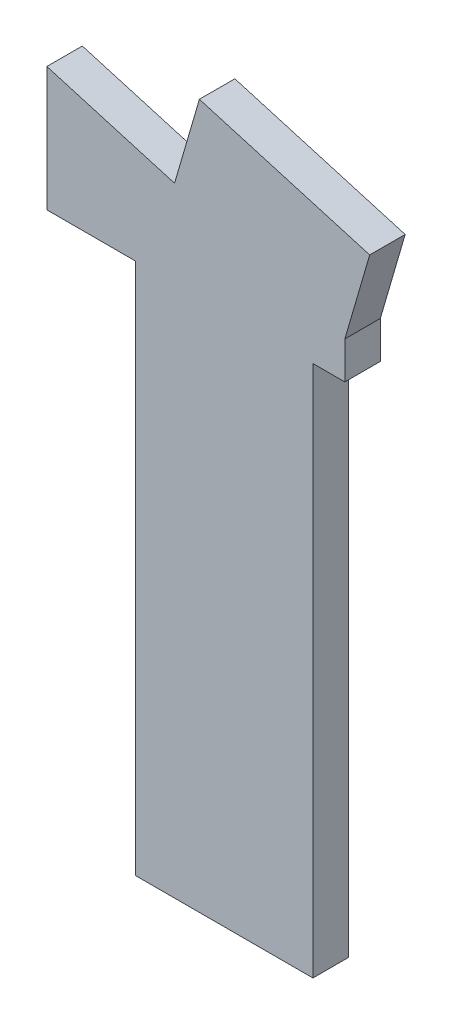
ISO-10303-21;
HEADER;
FILE_DESCRIPTION(('STEP AP214'),'2;1');
FILE_NAME('part.step','',(''),(''),'','','');
FILE_SCHEMA(('AUTOMOTIVE_DESIGN { 1 0 10303 214 1 1 1 1 }'));
ENDSEC;
DATA;
#1=APPLICATION_CONTEXT('core data for automotive mechanical design processes');
#2=APPLICATION_PROTOCOL_DEFINITION('international standard','automotive_design',2000,#1);
#3=PRODUCT_CONTEXT('',#1,'mechanical');
#4=PRODUCT('Part','Part','',(#3));
#5=PRODUCT_RELATED_PRODUCT_CATEGORY('part','',(#4));
#6=PRODUCT_DEFINITION_FORMATION('','',#4);
#7=PRODUCT_DEFINITION_CONTEXT('part definition',#1,'design');
#8=PRODUCT_DEFINITION('design','',#6,#7);
#9=PRODUCT_DEFINITION_SHAPE('','',#8);
#10=(LENGTH_UNIT() NAMED_UNIT(*) SI_UNIT(.MILLI.,.METRE.));
#11=(NAMED_UNIT(*) PLANE_ANGLE_UNIT() SI_UNIT($,.RADIAN.));
#12=(NAMED_UNIT(*) SI_UNIT($,.STERADIAN.) SOLID_ANGLE_UNIT());
#13=UNCERTAINTY_MEASURE_WITH_UNIT(LENGTH_MEASURE(1.E-05),#10,'distance_accuracy_value','');
#14=(GEOMETRIC_REPRESENTATION_CONTEXT(3) GLOBAL_UNCERTAINTY_ASSIGNED_CONTEXT((#13)) GLOBAL_UNIT_ASSIGNED_CONTEXT((#10,
#11,#12)) REPRESENTATION_CONTEXT('',''));
#15=CARTESIAN_POINT('',(0.,0.,0.));
#16=DIRECTION('',(0.,0.,1.));
#17=DIRECTION('',(1.,0.,0.));
#18=AXIS2_PLACEMENT_3D('',#15,#16,#17);
#19=CARTESIAN_POINT('',(15.,0.,2.));
#20=DIRECTION('',(1.,0.,0.));
#21=DIRECTION('',(0.,1.,0.));
#22=AXIS2_PLACEMENT_3D('',#19,#20,#21);
#23=PLANE('',#22);
#24=DIRECTION('',(0.,-1.,0.));
#25=VECTOR('',#24,1.);
#26=CARTESIAN_POINT('',(15.,0.,0.));
#27=LINE('',#26,#25);
#28=CARTESIAN_POINT('',(15.,0.,0.));
#29=VERTEX_POINT('',#28);
#30=CARTESIAN_POINT('',(15.,-30.,0.));
#31=VERTEX_POINT('',#30);
#32=EDGE_CURVE('E148',#29,#31,#27,.T.);
#33=ORIENTED_EDGE('',*,*,#32,.F.);
#34=DIRECTION('',(0.,0.,-1.));
#35=VECTOR('',#34,1.);
#36=CARTESIAN_POINT('',(15.,0.,2.));
#37=LINE('',#36,#35);
#38=CARTESIAN_POINT('',(15.,0.,2.));
#39=VERTEX_POINT('',#38);
#40=EDGE_CURVE('E11',#39,#29,#37,.T.);
#41=ORIENTED_EDGE('',*,*,#40,.F.);
#42=DIRECTION('',(0.,-1.,0.));
#43=VECTOR('',#42,1.);
#44=CARTESIAN_POINT('',(15.,0.,2.));
#45=LINE('',#44,#43);
#46=CARTESIAN_POINT('',(15.,-30.,2.));
#47=VERTEX_POINT('',#46);
#48=EDGE_CURVE('E173',#39,#47,#45,.T.);
#49=ORIENTED_EDGE('',*,*,#48,.T.);
#50=DIRECTION('',(0.,0.,-1.));
#51=VECTOR('',#50,1.);
#52=CARTESIAN_POINT('',(15.,-30.,2.));
#53=LINE('',#52,#51);
#54=EDGE_CURVE('E95',#47,#31,#53,.T.);
#55=ORIENTED_EDGE('',*,*,#54,.T.);
#56=EDGE_LOOP('',(#33,#41,#49,#55));
#57=FACE_BOUND('',#56,.T.);
#58=ADVANCED_FACE('F35',(#57),#23,.T.);
#59=CARTESIAN_POINT('',(0.,0.,2.));
#60=DIRECTION('',(0.,1.,0.));
#61=DIRECTION('',(0.,0.,1.));
#62=AXIS2_PLACEMENT_3D('',#59,#60,#61);
#63=PLANE('',#62);
#64=DIRECTION('',(1.,0.,0.));
#65=VECTOR('',#64,1.);
#66=CARTESIAN_POINT('',(0.,0.,0.));
#67=LINE('',#66,#65);
#68=CARTESIAN_POINT('',(16.8,0.,0.));
#69=VERTEX_POINT('',#68);
#70=EDGE_CURVE('E151',#29,#69,#67,.T.);
#71=ORIENTED_EDGE('',*,*,#70,.T.);
#72=DIRECTION('',(0.,0.,-1.));
#73=VECTOR('',#72,1.);
#74=CARTESIAN_POINT('',(16.8,0.,2.));
#75=LINE('',#74,#73);
#76=CARTESIAN_POINT('',(16.8,0.,2.));
#77=VERTEX_POINT('',#76);
#78=EDGE_CURVE('E43',#77,#69,#75,.T.);
#79=ORIENTED_EDGE('',*,*,#78,.F.);
#80=DIRECTION('',(1.,0.,0.));
#81=VECTOR('',#80,1.);
#82=CARTESIAN_POINT('',(0.,0.,2.));
#83=LINE('',#82,#81);
#84=EDGE_CURVE('E134',#39,#77,#83,.T.);
#85=ORIENTED_EDGE('',*,*,#84,.F.);
#86=ORIENTED_EDGE('',*,*,#40,.T.);
#87=EDGE_LOOP('',(#71,#79,#85,#86));
#88=FACE_BOUND('',#87,.T.);
#89=ADVANCED_FACE('F196',(#88),#63,.F.);
#90=CARTESIAN_POINT('',(16.8,0.,2.));
#91=DIRECTION('',(1.,0.,0.));
#92=DIRECTION('',(0.,0.,-1.));
#93=AXIS2_PLACEMENT_3D('',#90,#91,#92);
#94=PLANE('',#93);
#95=DIRECTION('',(0.,-1.,0.));
#96=VECTOR('',#95,1.);
#97=CARTESIAN_POINT('',(16.8,0.,0.));
#98=LINE('',#97,#96);
#99=CARTESIAN_POINT('',(16.8,2.1,0.));
#100=VERTEX_POINT('',#99);
#101=EDGE_CURVE('E154',#100,#69,#98,.T.);
#102=ORIENTED_EDGE('',*,*,#101,.F.);
#103=DIRECTION('',(0.,0.,-1.));
#104=VECTOR('',#103,1.);
#105=CARTESIAN_POINT('',(16.8,2.1,2.));
#106=LINE('',#105,#104);
#107=CARTESIAN_POINT('',(16.8,2.1,2.));
#108=VERTEX_POINT('',#107);
#109=EDGE_CURVE('E186',#108,#100,#106,.T.);
#110=ORIENTED_EDGE('',*,*,#109,.F.);
#111=DIRECTION('',(0.,-1.,0.));
#112=VECTOR('',#111,1.);
#113=CARTESIAN_POINT('',(16.8,0.,2.));
#114=LINE('',#113,#112);
#115=EDGE_CURVE('E193',#108,#77,#114,.T.);
#116=ORIENTED_EDGE('',*,*,#115,.T.);
#117=ORIENTED_EDGE('',*,*,#78,.T.);
#118=EDGE_LOOP('',(#102,#110,#116,#117));
#119=FACE_BOUND('',#118,.T.);
#120=ADVANCED_FACE('F191',(#119),#94,.T.);
#121=CARTESIAN_POINT('',(14.9184,-4.35119999999999,2.));
#122=DIRECTION('',(-0.96,0.28,0.));
#123=DIRECTION('',(-0.28,-0.96,0.));
#124=AXIS2_PLACEMENT_3D('',#121,#122,#123);
#125=PLANE('',#124);
#126=DIRECTION('',(0.28,0.96,0.));
#127=VECTOR('',#126,1.);
#128=CARTESIAN_POINT('',(14.9184,-4.35119999999999,0.));
#129=LINE('',#128,#127);
#130=CARTESIAN_POINT('',(18.2,6.9,0.));
#131=VERTEX_POINT('',#130);
#132=EDGE_CURVE('E157',#100,#131,#129,.T.);
#133=ORIENTED_EDGE('',*,*,#132,.T.);
#134=DIRECTION('',(0.,0.,-1.));
#135=VECTOR('',#134,1.);
#136=CARTESIAN_POINT('',(18.2,6.9,2.));
#137=LINE('',#136,#135);
#138=CARTESIAN_POINT('',(18.2,6.9,2.));
#139=VERTEX_POINT('',#138);
#140=EDGE_CURVE('E184',#139,#131,#137,.T.);
#141=ORIENTED_EDGE('',*,*,#140,.F.);
#142=DIRECTION('',(0.28,0.96,0.));
#143=VECTOR('',#142,1.);
#144=CARTESIAN_POINT('',(14.9184,-4.35119999999999,2.));
#145=LINE('',#144,#143);
#146=EDGE_CURVE('E206',#108,#139,#145,.T.);
#147=ORIENTED_EDGE('',*,*,#146,.F.);
#148=ORIENTED_EDGE('',*,*,#109,.T.);
#149=EDGE_LOOP('',(#133,#141,#147,#148));
#150=FACE_BOUND('',#149,.T.);
#151=ADVANCED_FACE('F203',(#150),#125,.F.);
#152=CARTESIAN_POINT('',(3.2816,11.2512,2.));
#153=DIRECTION('',(0.28,0.96,0.));
#154=DIRECTION('',(-0.96,0.28,0.));
#155=AXIS2_PLACEMENT_3D('',#152,#153,#154);
#156=PLANE('',#155);
#157=DIRECTION('',(0.96,-0.28,0.));
#158=VECTOR('',#157,1.);
#159=CARTESIAN_POINT('',(3.2816,11.2512,0.));
#160=LINE('',#159,#158);
#161=CARTESIAN_POINT('',(8.6,9.7,0.));
#162=VERTEX_POINT('',#161);
#163=EDGE_CURVE('E160',#162,#131,#160,.T.);
#164=ORIENTED_EDGE('',*,*,#163,.F.);
#165=DIRECTION('',(0.,0.,-1.));
#166=VECTOR('',#165,1.);
#167=CARTESIAN_POINT('',(8.6,9.7,2.));
#168=LINE('',#167,#166);
#169=CARTESIAN_POINT('',(8.6,9.7,2.));
#170=VERTEX_POINT('',#169);
#171=EDGE_CURVE('E182',#170,#162,#168,.T.);
#172=ORIENTED_EDGE('',*,*,#171,.F.);
#173=DIRECTION('',(0.96,-0.28,0.));
#174=VECTOR('',#173,1.);
#175=CARTESIAN_POINT('',(3.2816,11.2512,2.));
#176=LINE('',#175,#174);
#177=EDGE_CURVE('E208',#170,#139,#176,.T.);
#178=ORIENTED_EDGE('',*,*,#177,.T.);
#179=ORIENTED_EDGE('',*,*,#140,.T.);
#180=EDGE_LOOP('',(#164,#172,#178,#179));
#181=FACE_BOUND('',#180,.T.);
#182=ADVANCED_FACE('F252',(#181),#156,.T.);
#183=CARTESIAN_POINT('',(5.3184,-1.5512,2.));
#184=DIRECTION('',(-0.96,0.28,0.));
#185=DIRECTION('',(-0.28,-0.96,0.));
#186=AXIS2_PLACEMENT_3D('',#183,#184,#185);
#187=PLANE('',#186);
#188=DIRECTION('',(0.28,0.96,0.));
#189=VECTOR('',#188,1.);
#190=CARTESIAN_POINT('',(5.3184,-1.5512,0.));
#191=LINE('',#190,#189);
#192=CARTESIAN_POINT('',(7.2,4.9,0.));
#193=VERTEX_POINT('',#192);
#194=EDGE_CURVE('E163',#193,#162,#191,.T.);
#195=ORIENTED_EDGE('',*,*,#194,.F.);
#196=DIRECTION('',(0.,0.,-1.));
#197=VECTOR('',#196,1.);
#198=CARTESIAN_POINT('',(7.2,4.9,2.));
#199=LINE('',#198,#197);
#200=CARTESIAN_POINT('',(7.2,4.9,2.));
#201=VERTEX_POINT('',#200);
#202=EDGE_CURVE('E180',#201,#193,#199,.T.);
#203=ORIENTED_EDGE('',*,*,#202,.F.);
#204=DIRECTION('',(0.28,0.96,0.));
#205=VECTOR('',#204,1.);
#206=CARTESIAN_POINT('',(5.3184,-1.5512,2.));
#207=LINE('',#206,#205);
#208=EDGE_CURVE('E214',#201,#170,#207,.T.);
#209=ORIENTED_EDGE('',*,*,#208,.T.);
#210=ORIENTED_EDGE('',*,*,#171,.T.);
#211=EDGE_LOOP('',(#195,#203,#209,#210));
#212=FACE_BOUND('',#211,.T.);
#213=ADVANCED_FACE('F247',(#212),#187,.T.);
#214=CARTESIAN_POINT('',(1.8816,6.4512,2.));
#215=DIRECTION('',(-0.28,-0.96,0.));
#216=DIRECTION('',(0.96,-0.28,0.));
#217=AXIS2_PLACEMENT_3D('',#214,#215,#216);
#218=PLANE('',#217);
#219=DIRECTION('',(-0.96,0.28,0.));
#220=VECTOR('',#219,1.);
#221=CARTESIAN_POINT('',(1.8816,6.4512,0.));
#222=LINE('',#221,#220);
#223=CARTESIAN_POINT('',(0.,7.,0.));
#224=VERTEX_POINT('',#223);
#225=EDGE_CURVE('E166',#193,#224,#222,.T.);
#226=ORIENTED_EDGE('',*,*,#225,.T.);
#227=DIRECTION('',(0.,0.,-1.));
#228=VECTOR('',#227,1.);
#229=CARTESIAN_POINT('',(0.,7.,2.));
#230=LINE('',#229,#228);
#231=CARTESIAN_POINT('',(0.,7.,2.));
#232=VERTEX_POINT('',#231);
#233=EDGE_CURVE('E177',#232,#224,#230,.T.);
#234=ORIENTED_EDGE('',*,*,#233,.F.);
#235=DIRECTION('',(-0.96,0.28,0.));
#236=VECTOR('',#235,1.);
#237=CARTESIAN_POINT('',(1.8816,6.4512,2.));
#238=LINE('',#237,#236);
#239=EDGE_CURVE('E216',#201,#232,#238,.T.);
#240=ORIENTED_EDGE('',*,*,#239,.F.);
#241=ORIENTED_EDGE('',*,*,#202,.T.);
#242=EDGE_LOOP('',(#226,#234,#240,#241));
#243=FACE_BOUND('',#242,.T.);
#244=ADVANCED_FACE('F221',(#243),#218,.F.);
#245=CARTESIAN_POINT('',(0.,0.,2.));
#246=DIRECTION('',(1.,0.,0.));
#247=DIRECTION('',(0.,1.,0.));
#248=AXIS2_PLACEMENT_3D('',#245,#246,#247);
#249=PLANE('',#248);
#250=DIRECTION('',(0.,-1.,0.));
#251=VECTOR('',#250,1.);
#252=CARTESIAN_POINT('',(0.,0.,0.));
#253=LINE('',#252,#251);
#254=CARTESIAN_POINT('',(0.,0.,0.));
#255=VERTEX_POINT('',#254);
#256=EDGE_CURVE('E168',#224,#255,#253,.T.);
#257=ORIENTED_EDGE('',*,*,#256,.T.);
#258=DIRECTION('',(0.,0.,-1.));
#259=VECTOR('',#258,1.);
#260=CARTESIAN_POINT('',(0.,0.,2.));
#261=LINE('',#260,#259);
#262=CARTESIAN_POINT('',(0.,0.,2.));
#263=VERTEX_POINT('',#262);
#264=EDGE_CURVE('E139',#263,#255,#261,.T.);
#265=ORIENTED_EDGE('',*,*,#264,.F.);
#266=DIRECTION('',(0.,-1.,0.));
#267=VECTOR('',#266,1.);
#268=CARTESIAN_POINT('',(0.,0.,2.));
#269=LINE('',#268,#267);
#270=EDGE_CURVE('E129',#232,#263,#269,.T.);
#271=ORIENTED_EDGE('',*,*,#270,.F.);
#272=ORIENTED_EDGE('',*,*,#233,.T.);
#273=EDGE_LOOP('',(#257,#265,#271,#272));
#274=FACE_BOUND('',#273,.T.);
#275=ADVANCED_FACE('F225',(#274),#249,.F.);
#276=CARTESIAN_POINT('',(5.,0.,0.));
#277=VERTEX_POINT('',#276);
#278=EDGE_CURVE('E138',#255,#277,#67,.T.);
#279=ORIENTED_EDGE('',*,*,#278,.T.);
#280=DIRECTION('',(0.,0.,-1.));
#281=VECTOR('',#280,1.);
#282=CARTESIAN_POINT('',(5.,0.,2.));
#283=LINE('',#282,#281);
#284=CARTESIAN_POINT('',(5.,0.,2.));
#285=VERTEX_POINT('',#284);
#286=EDGE_CURVE('E135',#285,#277,#283,.T.);
#287=ORIENTED_EDGE('',*,*,#286,.F.);
#288=EDGE_CURVE('E123',#263,#285,#83,.T.);
#289=ORIENTED_EDGE('',*,*,#288,.F.);
#290=ORIENTED_EDGE('',*,*,#264,.T.);
#291=EDGE_LOOP('',(#279,#287,#289,#290));
#292=FACE_BOUND('',#291,.T.);
#293=ADVANCED_FACE('F136',(#292),#63,.F.);
#294=CARTESIAN_POINT('',(5.,0.,2.));
#295=DIRECTION('',(1.,0.,0.));
#296=DIRECTION('',(0.,1.,0.));
#297=AXIS2_PLACEMENT_3D('',#294,#295,#296);
#298=PLANE('',#297);
#299=DIRECTION('',(0.,-1.,0.));
#300=VECTOR('',#299,1.);
#301=CARTESIAN_POINT('',(5.,0.,0.));
#302=LINE('',#301,#300);
#303=CARTESIAN_POINT('',(5.,-30.,0.));
#304=VERTEX_POINT('',#303);
#305=EDGE_CURVE('E88',#277,#304,#302,.T.);
#306=ORIENTED_EDGE('',*,*,#305,.T.);
#307=DIRECTION('',(0.,0.,-1.));
#308=VECTOR('',#307,1.);
#309=CARTESIAN_POINT('',(5.,-30.,2.));
#310=LINE('',#309,#308);
#311=CARTESIAN_POINT('',(5.,-30.,2.));
#312=VERTEX_POINT('',#311);
#313=EDGE_CURVE('E140',#312,#304,#310,.T.);
#314=ORIENTED_EDGE('',*,*,#313,.F.);
#315=DIRECTION('',(0.,-1.,0.));
#316=VECTOR('',#315,1.);
#317=CARTESIAN_POINT('',(5.,0.,2.));
#318=LINE('',#317,#316);
#319=EDGE_CURVE('E127',#285,#312,#318,.T.);
#320=ORIENTED_EDGE('',*,*,#319,.F.);
#321=ORIENTED_EDGE('',*,*,#286,.T.);
#322=EDGE_LOOP('',(#306,#314,#320,#321));
#323=FACE_BOUND('',#322,.T.);
#324=ADVANCED_FACE('F142',(#323),#298,.F.);
#325=CARTESIAN_POINT('',(0.,-30.,2.));
#326=DIRECTION('',(0.,1.,0.));
#327=DIRECTION('',(0.,0.,1.));
#328=AXIS2_PLACEMENT_3D('',#325,#326,#327);
#329=PLANE('',#328);
#330=DIRECTION('',(1.,0.,0.));
#331=VECTOR('',#330,1.);
#332=CARTESIAN_POINT('',(0.,-30.,0.));
#333=LINE('',#332,#331);
#334=EDGE_CURVE('E171',#304,#31,#333,.T.);
#335=ORIENTED_EDGE('',*,*,#334,.T.);
#336=ORIENTED_EDGE('',*,*,#54,.F.);
#337=DIRECTION('',(1.,0.,0.));
#338=VECTOR('',#337,1.);
#339=CARTESIAN_POINT('',(0.,-30.,2.));
#340=LINE('',#339,#338);
#341=EDGE_CURVE('E51',#312,#47,#340,.T.);
#342=ORIENTED_EDGE('',*,*,#341,.F.);
#343=ORIENTED_EDGE('',*,*,#313,.T.);
#344=EDGE_LOOP('',(#335,#336,#342,#343));
#345=FACE_BOUND('',#344,.T.);
#346=ADVANCED_FACE('F228',(#345),#329,.F.);
#347=CARTESIAN_POINT('',(0.,0.,2.));
#348=DIRECTION('',(0.,0.,1.));
#349=DIRECTION('',(1.,0.,0.));
#350=AXIS2_PLACEMENT_3D('',#347,#348,#349);
#351=PLANE('',#350);
#352=ORIENTED_EDGE('',*,*,#48,.F.);
#353=ORIENTED_EDGE('',*,*,#84,.T.);
#354=ORIENTED_EDGE('',*,*,#115,.F.);
#355=ORIENTED_EDGE('',*,*,#146,.T.);
#356=ORIENTED_EDGE('',*,*,#177,.F.);
#357=ORIENTED_EDGE('',*,*,#208,.F.);
#358=ORIENTED_EDGE('',*,*,#239,.T.);
#359=ORIENTED_EDGE('',*,*,#270,.T.);
#360=ORIENTED_EDGE('',*,*,#288,.T.);
#361=ORIENTED_EDGE('',*,*,#319,.T.);
#362=ORIENTED_EDGE('',*,*,#341,.T.);
#363=EDGE_LOOP('',(#352,#353,#354,#355,#356,#357,#358,#359,#360,#361,#362));
#364=FACE_BOUND('',#363,.T.);
#365=ADVANCED_FACE('F125',(#364),#351,.T.);
#366=CARTESIAN_POINT('',(0.,0.,0.));
#367=DIRECTION('',(0.,0.,1.));
#368=DIRECTION('',(1.,0.,0.));
#369=AXIS2_PLACEMENT_3D('',#366,#367,#368);
#370=PLANE('',#369);
#371=ORIENTED_EDGE('',*,*,#32,.T.);
#372=ORIENTED_EDGE('',*,*,#334,.F.);
#373=ORIENTED_EDGE('',*,*,#305,.F.);
#374=ORIENTED_EDGE('',*,*,#278,.F.);
#375=ORIENTED_EDGE('',*,*,#256,.F.);
#376=ORIENTED_EDGE('',*,*,#225,.F.);
#377=ORIENTED_EDGE('',*,*,#194,.T.);
#378=ORIENTED_EDGE('',*,*,#163,.T.);
#379=ORIENTED_EDGE('',*,*,#132,.F.);
#380=ORIENTED_EDGE('',*,*,#101,.T.);
#381=ORIENTED_EDGE('',*,*,#70,.F.);
#382=EDGE_LOOP('',(#371,#372,#373,#374,#375,#376,#377,#378,#379,#380,#381));
#383=FACE_BOUND('',#382,.T.);
#384=ADVANCED_FACE('F199',(#383),#370,.F.);
#385=CLOSED_SHELL('',(#58,#89,#120,#151,#182,#213,#244,#275,#293,#324,#346,#365,#384));
#386=MANIFOLD_SOLID_BREP('B2',#385);
#387=ADVANCED_BREP_SHAPE_REPRESENTATION('',(#18,#386),#14);
#388=SHAPE_DEFINITION_REPRESENTATION(#9,#387);
ENDSEC;
END-ISO-10303-21;
